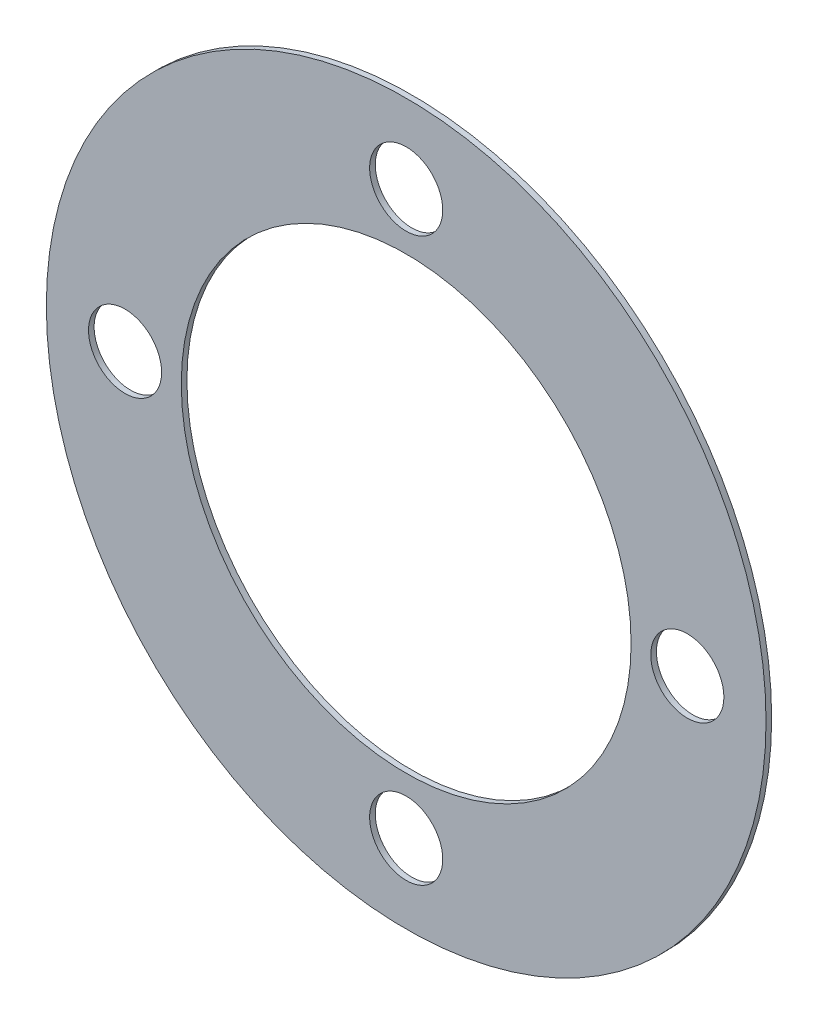
ISO-10303-21;
HEADER;
FILE_DESCRIPTION(('STEP AP214'),'2;1');
FILE_NAME('part.step','',(''),(''),'','','');
FILE_SCHEMA(('AUTOMOTIVE_DESIGN { 1 0 10303 214 1 1 1 1 }'));
ENDSEC;
DATA;
#1=APPLICATION_CONTEXT('core data for automotive mechanical design processes');
#2=APPLICATION_PROTOCOL_DEFINITION('international standard','automotive_design',2000,#1);
#3=PRODUCT_CONTEXT('',#1,'mechanical');
#4=PRODUCT('Part','Part','',(#3));
#5=PRODUCT_RELATED_PRODUCT_CATEGORY('part','',(#4));
#6=PRODUCT_DEFINITION_FORMATION('','',#4);
#7=PRODUCT_DEFINITION_CONTEXT('part definition',#1,'design');
#8=PRODUCT_DEFINITION('design','',#6,#7);
#9=PRODUCT_DEFINITION_SHAPE('','',#8);
#10=(LENGTH_UNIT() NAMED_UNIT(*) SI_UNIT(.MILLI.,.METRE.));
#11=(NAMED_UNIT(*) PLANE_ANGLE_UNIT() SI_UNIT($,.RADIAN.));
#12=(NAMED_UNIT(*) SI_UNIT($,.STERADIAN.) SOLID_ANGLE_UNIT());
#13=UNCERTAINTY_MEASURE_WITH_UNIT(LENGTH_MEASURE(1.E-05),#10,'distance_accuracy_value','');
#14=(GEOMETRIC_REPRESENTATION_CONTEXT(3) GLOBAL_UNCERTAINTY_ASSIGNED_CONTEXT((#13)) GLOBAL_UNIT_ASSIGNED_CONTEXT((#10,
#11,#12)) REPRESENTATION_CONTEXT('',''));
#15=CARTESIAN_POINT('',(0.,0.,0.));
#16=DIRECTION('',(0.,0.,1.));
#17=DIRECTION('',(1.,0.,0.));
#18=AXIS2_PLACEMENT_3D('',#15,#16,#17);
#19=CARTESIAN_POINT('',(0.,0.,0.5));
#20=DIRECTION('',(0.,0.,1.));
#21=DIRECTION('',(1.,0.,0.));
#22=AXIS2_PLACEMENT_3D('',#19,#20,#21);
#23=PLANE('',#22);
#24=CARTESIAN_POINT('',(1.4119006205266E-12,-25.,0.5));
#25=DIRECTION('',(0.,0.,1.));
#26=DIRECTION('',(1.,0.,0.));
#27=AXIS2_PLACEMENT_3D('',#24,#25,#26);
#28=CIRCLE('',#27,3.25000000000152);
#29=CARTESIAN_POINT('',(3.25000000000293,-25.,0.5));
#30=VERTEX_POINT('',#29);
#31=EDGE_CURVE('E72',#30,#30,#28,.T.);
#32=ORIENTED_EDGE('',*,*,#31,.F.);
#33=EDGE_LOOP('',(#32));
#34=FACE_BOUND('',#33,.T.);
#35=CARTESIAN_POINT('',(0.,25.,0.5));
#36=DIRECTION('',(0.,0.,1.));
#37=DIRECTION('',(1.,0.,0.));
#38=AXIS2_PLACEMENT_3D('',#35,#36,#37);
#39=CIRCLE('',#38,3.25);
#40=CARTESIAN_POINT('',(3.25,25.,0.5));
#41=VERTEX_POINT('',#40);
#42=EDGE_CURVE('E56',#41,#41,#39,.T.);
#43=ORIENTED_EDGE('',*,*,#42,.F.);
#44=EDGE_LOOP('',(#43));
#45=FACE_BOUND('',#44,.T.);
#46=CARTESIAN_POINT('',(0.,0.,0.5));
#47=DIRECTION('',(0.,0.,1.));
#48=DIRECTION('',(1.,0.,0.));
#49=AXIS2_PLACEMENT_3D('',#46,#47,#48);
#50=CIRCLE('',#49,32.);
#51=CARTESIAN_POINT('',(32.,0.,0.5));
#52=VERTEX_POINT('',#51);
#53=EDGE_CURVE('E10',#52,#52,#50,.T.);
#54=ORIENTED_EDGE('',*,*,#53,.T.);
#55=EDGE_LOOP('',(#54));
#56=FACE_BOUND('',#55,.T.);
#57=CARTESIAN_POINT('',(0.,0.,0.5));
#58=DIRECTION('',(0.,0.,1.));
#59=DIRECTION('',(1.,0.,0.));
#60=AXIS2_PLACEMENT_3D('',#57,#58,#59);
#61=CIRCLE('',#60,20.);
#62=CARTESIAN_POINT('',(20.,0.,0.5));
#63=VERTEX_POINT('',#62);
#64=EDGE_CURVE('E50',#63,#63,#61,.T.);
#65=ORIENTED_EDGE('',*,*,#64,.F.);
#66=EDGE_LOOP('',(#65));
#67=FACE_BOUND('',#66,.T.);
#68=CARTESIAN_POINT('',(25.0000000000007,7.05950310263298E-13,0.5));
#69=DIRECTION('',(0.,0.,1.));
#70=DIRECTION('',(1.,0.,0.));
#71=AXIS2_PLACEMENT_3D('',#68,#69,#70);
#72=CIRCLE('',#71,3.25000000000055);
#73=CARTESIAN_POINT('',(28.2500000000013,7.05950310263298E-13,0.5));
#74=VERTEX_POINT('',#73);
#75=EDGE_CURVE('E64',#74,#74,#72,.T.);
#76=ORIENTED_EDGE('',*,*,#75,.F.);
#77=EDGE_LOOP('',(#76));
#78=FACE_BOUND('',#77,.T.);
#79=CARTESIAN_POINT('',(-24.9999999999993,-7.09011927261166E-13,0.5));
#80=DIRECTION('',(0.,0.,1.));
#81=DIRECTION('',(1.,0.,0.));
#82=AXIS2_PLACEMENT_3D('',#79,#80,#81);
#83=CIRCLE('',#82,3.25000000000113);
#84=CARTESIAN_POINT('',(-21.7499999999982,-7.09011927261166E-13,0.5));
#85=VERTEX_POINT('',#84);
#86=EDGE_CURVE('E80',#85,#85,#83,.T.);
#87=ORIENTED_EDGE('',*,*,#86,.F.);
#88=EDGE_LOOP('',(#87));
#89=FACE_BOUND('',#88,.T.);
#90=ADVANCED_FACE('F37',(#34,#45,#56,#67,#78,#89),#23,.T.);
#91=CARTESIAN_POINT('',(0.,0.,0.));
#92=DIRECTION('',(0.,0.,1.));
#93=DIRECTION('',(1.,0.,0.));
#94=AXIS2_PLACEMENT_3D('',#91,#92,#93);
#95=PLANE('',#94);
#96=CARTESIAN_POINT('',(0.,0.,0.));
#97=DIRECTION('',(0.,0.,1.));
#98=DIRECTION('',(1.,0.,0.));
#99=AXIS2_PLACEMENT_3D('',#96,#97,#98);
#100=CIRCLE('',#99,32.);
#101=CARTESIAN_POINT('',(32.,0.,0.));
#102=VERTEX_POINT('',#101);
#103=EDGE_CURVE('E41',#102,#102,#100,.T.);
#104=ORIENTED_EDGE('',*,*,#103,.F.);
#105=EDGE_LOOP('',(#104));
#106=FACE_BOUND('',#105,.T.);
#107=CARTESIAN_POINT('',(0.,0.,0.));
#108=DIRECTION('',(0.,0.,1.));
#109=DIRECTION('',(1.,0.,0.));
#110=AXIS2_PLACEMENT_3D('',#107,#108,#109);
#111=CIRCLE('',#110,20.);
#112=CARTESIAN_POINT('',(20.,0.,0.));
#113=VERTEX_POINT('',#112);
#114=EDGE_CURVE('E52',#113,#113,#111,.T.);
#115=ORIENTED_EDGE('',*,*,#114,.T.);
#116=EDGE_LOOP('',(#115));
#117=FACE_BOUND('',#116,.T.);
#118=CARTESIAN_POINT('',(0.,25.,0.));
#119=DIRECTION('',(0.,0.,1.));
#120=DIRECTION('',(1.,0.,0.));
#121=AXIS2_PLACEMENT_3D('',#118,#119,#120);
#122=CIRCLE('',#121,3.25);
#123=CARTESIAN_POINT('',(3.25,25.,0.));
#124=VERTEX_POINT('',#123);
#125=EDGE_CURVE('E60',#124,#124,#122,.T.);
#126=ORIENTED_EDGE('',*,*,#125,.T.);
#127=EDGE_LOOP('',(#126));
#128=FACE_BOUND('',#127,.T.);
#129=CARTESIAN_POINT('',(25.0000000000007,7.05950310263298E-13,0.));
#130=DIRECTION('',(0.,0.,1.));
#131=DIRECTION('',(1.,0.,0.));
#132=AXIS2_PLACEMENT_3D('',#129,#130,#131);
#133=CIRCLE('',#132,3.25000000000055);
#134=CARTESIAN_POINT('',(28.2500000000013,7.05950310263298E-13,0.));
#135=VERTEX_POINT('',#134);
#136=EDGE_CURVE('E68',#135,#135,#133,.T.);
#137=ORIENTED_EDGE('',*,*,#136,.T.);
#138=EDGE_LOOP('',(#137));
#139=FACE_BOUND('',#138,.T.);
#140=CARTESIAN_POINT('',(1.4119006205266E-12,-25.,0.));
#141=DIRECTION('',(0.,0.,1.));
#142=DIRECTION('',(1.,0.,0.));
#143=AXIS2_PLACEMENT_3D('',#140,#141,#142);
#144=CIRCLE('',#143,3.25000000000152);
#145=CARTESIAN_POINT('',(3.25000000000293,-25.,0.));
#146=VERTEX_POINT('',#145);
#147=EDGE_CURVE('E76',#146,#146,#144,.T.);
#148=ORIENTED_EDGE('',*,*,#147,.T.);
#149=EDGE_LOOP('',(#148));
#150=FACE_BOUND('',#149,.T.);
#151=CARTESIAN_POINT('',(-24.9999999999993,-7.09011927261166E-13,0.));
#152=DIRECTION('',(0.,0.,1.));
#153=DIRECTION('',(1.,0.,0.));
#154=AXIS2_PLACEMENT_3D('',#151,#152,#153);
#155=CIRCLE('',#154,3.25000000000113);
#156=CARTESIAN_POINT('',(-21.7499999999982,-7.09011927261166E-13,0.));
#157=VERTEX_POINT('',#156);
#158=EDGE_CURVE('E84',#157,#157,#155,.T.);
#159=ORIENTED_EDGE('',*,*,#158,.T.);
#160=EDGE_LOOP('',(#159));
#161=FACE_BOUND('',#160,.T.);
#162=ADVANCED_FACE('F96',(#106,#117,#128,#139,#150,#161),#95,.F.);
#163=CARTESIAN_POINT('',(0.,0.,0.5));
#164=DIRECTION('',(0.,0.,-1.));
#165=DIRECTION('',(-1.,0.,0.));
#166=AXIS2_PLACEMENT_3D('',#163,#164,#165);
#167=CYLINDRICAL_SURFACE('',#166,32.);
#168=ORIENTED_EDGE('',*,*,#53,.F.);
#169=EDGE_LOOP('',(#168));
#170=FACE_BOUND('',#169,.T.);
#171=ORIENTED_EDGE('',*,*,#103,.T.);
#172=EDGE_LOOP('',(#171));
#173=FACE_BOUND('',#172,.T.);
#174=ADVANCED_FACE('F39',(#170,#173),#167,.T.);
#175=CARTESIAN_POINT('',(0.,0.,0.5));
#176=DIRECTION('',(0.,0.,-1.));
#177=DIRECTION('',(-1.,0.,0.));
#178=AXIS2_PLACEMENT_3D('',#175,#176,#177);
#179=CYLINDRICAL_SURFACE('',#178,20.);
#180=ORIENTED_EDGE('',*,*,#64,.T.);
#181=EDGE_LOOP('',(#180));
#182=FACE_BOUND('',#181,.T.);
#183=ORIENTED_EDGE('',*,*,#114,.F.);
#184=EDGE_LOOP('',(#183));
#185=FACE_BOUND('',#184,.T.);
#186=ADVANCED_FACE('F106',(#182,#185),#179,.F.);
#187=CARTESIAN_POINT('',(0.,25.,0.5));
#188=DIRECTION('',(0.,0.,-1.));
#189=DIRECTION('',(-1.,0.,0.));
#190=AXIS2_PLACEMENT_3D('',#187,#188,#189);
#191=CYLINDRICAL_SURFACE('',#190,3.25);
#192=ORIENTED_EDGE('',*,*,#42,.T.);
#193=EDGE_LOOP('',(#192));
#194=FACE_BOUND('',#193,.T.);
#195=ORIENTED_EDGE('',*,*,#125,.F.);
#196=EDGE_LOOP('',(#195));
#197=FACE_BOUND('',#196,.T.);
#198=ADVANCED_FACE('F109',(#194,#197),#191,.F.);
#199=CARTESIAN_POINT('',(25.0000000000007,7.05950310263298E-13,0.5));
#200=DIRECTION('',(0.,0.,-1.));
#201=DIRECTION('',(-1.,0.,0.));
#202=AXIS2_PLACEMENT_3D('',#199,#200,#201);
#203=CYLINDRICAL_SURFACE('',#202,3.25000000000055);
#204=ORIENTED_EDGE('',*,*,#75,.T.);
#205=EDGE_LOOP('',(#204));
#206=FACE_BOUND('',#205,.T.);
#207=ORIENTED_EDGE('',*,*,#136,.F.);
#208=EDGE_LOOP('',(#207));
#209=FACE_BOUND('',#208,.T.);
#210=ADVANCED_FACE('F113',(#206,#209),#203,.F.);
#211=CARTESIAN_POINT('',(1.4119006205266E-12,-25.,0.5));
#212=DIRECTION('',(0.,0.,-1.));
#213=DIRECTION('',(-1.,0.,0.));
#214=AXIS2_PLACEMENT_3D('',#211,#212,#213);
#215=CYLINDRICAL_SURFACE('',#214,3.25000000000152);
#216=ORIENTED_EDGE('',*,*,#31,.T.);
#217=EDGE_LOOP('',(#216));
#218=FACE_BOUND('',#217,.T.);
#219=ORIENTED_EDGE('',*,*,#147,.F.);
#220=EDGE_LOOP('',(#219));
#221=FACE_BOUND('',#220,.T.);
#222=ADVANCED_FACE('F117',(#218,#221),#215,.F.);
#223=CARTESIAN_POINT('',(-24.9999999999993,-7.09011927261166E-13,0.5));
#224=DIRECTION('',(0.,0.,-1.));
#225=DIRECTION('',(-1.,0.,0.));
#226=AXIS2_PLACEMENT_3D('',#223,#224,#225);
#227=CYLINDRICAL_SURFACE('',#226,3.25000000000113);
#228=ORIENTED_EDGE('',*,*,#86,.T.);
#229=EDGE_LOOP('',(#228));
#230=FACE_BOUND('',#229,.T.);
#231=ORIENTED_EDGE('',*,*,#158,.F.);
#232=EDGE_LOOP('',(#231));
#233=FACE_BOUND('',#232,.T.);
#234=ADVANCED_FACE('F92',(#230,#233),#227,.F.);
#235=CLOSED_SHELL('',(#90,#162,#174,#186,#198,#210,#222,#234));
#236=MANIFOLD_SOLID_BREP('B2',#235);
#237=ADVANCED_BREP_SHAPE_REPRESENTATION('',(#18,#236),#14);
#238=SHAPE_DEFINITION_REPRESENTATION(#9,#237);
ENDSEC;
END-ISO-10303-21;
